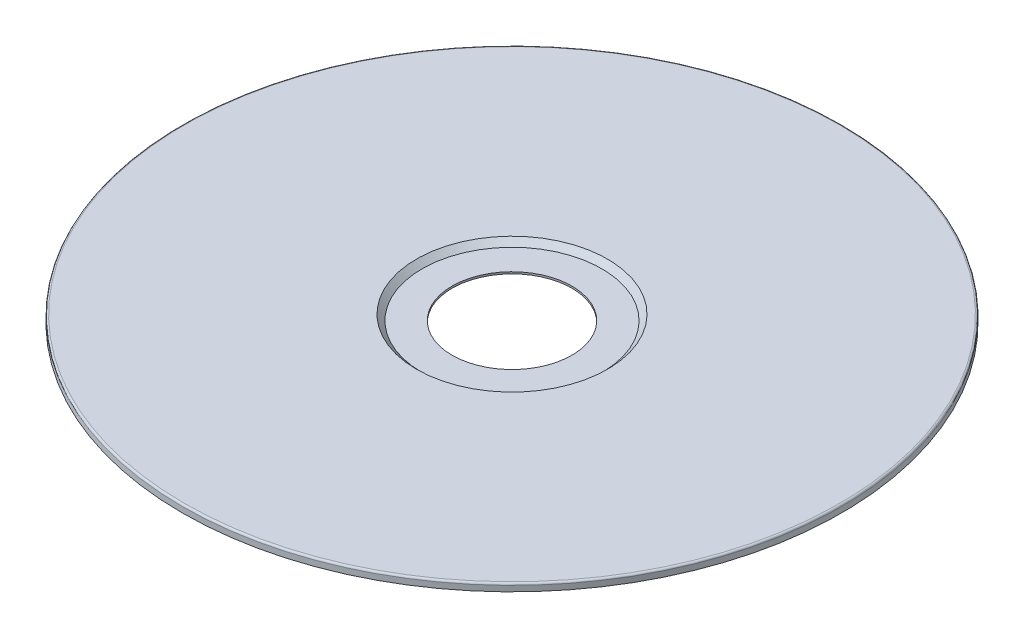
ISO-10303-21;
HEADER;
FILE_DESCRIPTION(('STEP AP214'),'2;1');
FILE_NAME('part.step','',(''),(''),'','','');
FILE_SCHEMA(('AUTOMOTIVE_DESIGN { 1 0 10303 214 1 1 1 1 }'));
ENDSEC;
DATA;
#1=APPLICATION_CONTEXT('core data for automotive mechanical design processes');
#2=APPLICATION_PROTOCOL_DEFINITION('international standard','automotive_design',2000,#1);
#3=PRODUCT_CONTEXT('',#1,'mechanical');
#4=PRODUCT('Part','Part','',(#3));
#5=PRODUCT_RELATED_PRODUCT_CATEGORY('part','',(#4));
#6=PRODUCT_DEFINITION_FORMATION('','',#4);
#7=PRODUCT_DEFINITION_CONTEXT('part definition',#1,'design');
#8=PRODUCT_DEFINITION('design','',#6,#7);
#9=PRODUCT_DEFINITION_SHAPE('','',#8);
#10=(LENGTH_UNIT() NAMED_UNIT(*) SI_UNIT(.MILLI.,.METRE.));
#11=(NAMED_UNIT(*) PLANE_ANGLE_UNIT() SI_UNIT($,.RADIAN.));
#12=(NAMED_UNIT(*) SI_UNIT($,.STERADIAN.) SOLID_ANGLE_UNIT());
#13=UNCERTAINTY_MEASURE_WITH_UNIT(LENGTH_MEASURE(1.E-05),#10,'distance_accuracy_value','');
#14=(GEOMETRIC_REPRESENTATION_CONTEXT(3) GLOBAL_UNCERTAINTY_ASSIGNED_CONTEXT((#13)) GLOBAL_UNIT_ASSIGNED_CONTEXT((#10,
#11,#12)) REPRESENTATION_CONTEXT('',''));
#15=CARTESIAN_POINT('',(0.,0.,0.));
#16=DIRECTION('',(0.,0.,1.));
#17=DIRECTION('',(1.,0.,0.));
#18=AXIS2_PLACEMENT_3D('',#15,#16,#17);
#19=CARTESIAN_POINT('',(0.,25.4,0.));
#20=DIRECTION('',(0.,-1.,0.));
#21=DIRECTION('',(0.,0.,-1.));
#22=AXIS2_PLACEMENT_3D('',#19,#20,#21);
#23=CYLINDRICAL_SURFACE('',#22,203.2);
#24=CARTESIAN_POINT('',(0.,0.,0.));
#25=DIRECTION('',(0.,1.,0.));
#26=DIRECTION('',(0.,0.,1.));
#27=AXIS2_PLACEMENT_3D('',#24,#25,#26);
#28=CIRCLE('',#27,203.2);
#29=CARTESIAN_POINT('',(0.,0.,203.2));
#30=VERTEX_POINT('',#29);
#31=EDGE_CURVE('E64',#30,#30,#28,.T.);
#32=ORIENTED_EDGE('',*,*,#31,.F.);
#33=EDGE_LOOP('',(#32));
#34=FACE_BOUND('',#33,.T.);
#35=CARTESIAN_POINT('',(0.,6.35,0.));
#36=DIRECTION('',(0.,1.,0.));
#37=DIRECTION('',(0.,0.,1.));
#38=AXIS2_PLACEMENT_3D('',#35,#36,#37);
#39=CIRCLE('',#38,203.2);
#40=CARTESIAN_POINT('',(0.,6.35,203.2));
#41=VERTEX_POINT('',#40);
#42=EDGE_CURVE('E60',#41,#41,#39,.T.);
#43=ORIENTED_EDGE('',*,*,#42,.T.);
#44=EDGE_LOOP('',(#43));
#45=FACE_BOUND('',#44,.T.);
#46=ADVANCED_FACE('F39',(#34,#45),#23,.F.);
#47=CARTESIAN_POINT('',(0.,25.4,0.));
#48=DIRECTION('',(0.,1.,0.));
#49=DIRECTION('',(0.,0.,1.));
#50=AXIS2_PLACEMENT_3D('',#47,#48,#49);
#51=PLANE('',#50);
#52=CARTESIAN_POINT('',(0.,25.4,0.));
#53=DIRECTION('',(0.,1.,0.));
#54=DIRECTION('',(0.,0.,1.));
#55=AXIS2_PLACEMENT_3D('',#52,#53,#54);
#56=CIRCLE('',#55,1111.25);
#57=CARTESIAN_POINT('',(0.,25.4,1111.25));
#58=VERTEX_POINT('',#57);
#59=EDGE_CURVE('E47',#58,#58,#56,.T.);
#60=ORIENTED_EDGE('',*,*,#59,.T.);
#61=EDGE_LOOP('',(#60));
#62=FACE_BOUND('',#61,.T.);
#63=CARTESIAN_POINT('',(0.,25.4,0.));
#64=DIRECTION('',(0.,1.,0.));
#65=DIRECTION('',(0.,0.,1.));
#66=AXIS2_PLACEMENT_3D('',#63,#64,#65);
#67=CIRCLE('',#66,323.850000000001);
#68=CARTESIAN_POINT('',(0.,25.4,323.850000000001));
#69=VERTEX_POINT('',#68);
#70=EDGE_CURVE('E52',#69,#69,#67,.F.);
#71=ORIENTED_EDGE('',*,*,#70,.T.);
#72=EDGE_LOOP('',(#71));
#73=FACE_BOUND('',#72,.T.);
#74=ADVANCED_FACE('F93',(#62,#73),#51,.T.);
#75=CARTESIAN_POINT('',(0.,0.,0.));
#76=DIRECTION('',(0.,1.,0.));
#77=DIRECTION('',(0.,0.,1.));
#78=AXIS2_PLACEMENT_3D('',#75,#76,#77);
#79=PLANE('',#78);
#80=CARTESIAN_POINT('',(0.,0.,0.));
#81=DIRECTION('',(0.,1.,0.));
#82=DIRECTION('',(0.,0.,1.));
#83=AXIS2_PLACEMENT_3D('',#80,#81,#82);
#84=CIRCLE('',#83,1117.6);
#85=CARTESIAN_POINT('',(0.,0.,1117.6));
#86=VERTEX_POINT('',#85);
#87=EDGE_CURVE('E57',#86,#86,#84,.T.);
#88=ORIENTED_EDGE('',*,*,#87,.F.);
#89=EDGE_LOOP('',(#88));
#90=FACE_BOUND('',#89,.T.);
#91=ORIENTED_EDGE('',*,*,#31,.T.);
#92=EDGE_LOOP('',(#91));
#93=FACE_BOUND('',#92,.T.);
#94=ADVANCED_FACE('F99',(#90,#93),#79,.F.);
#95=CARTESIAN_POINT('',(0.,25.4,0.));
#96=DIRECTION('',(0.,-1.,0.));
#97=DIRECTION('',(0.,0.,-1.));
#98=AXIS2_PLACEMENT_3D('',#95,#96,#97);
#99=CYLINDRICAL_SURFACE('',#98,1117.6);
#100=CARTESIAN_POINT('',(0.,19.05,0.));
#101=DIRECTION('',(0.,1.,0.));
#102=DIRECTION('',(0.,0.,1.));
#103=AXIS2_PLACEMENT_3D('',#100,#101,#102);
#104=CIRCLE('',#103,1117.6);
#105=CARTESIAN_POINT('',(0.,19.05,1117.6));
#106=VERTEX_POINT('',#105);
#107=EDGE_CURVE('E10',#106,#106,#104,.F.);
#108=ORIENTED_EDGE('',*,*,#107,.T.);
#109=EDGE_LOOP('',(#108));
#110=FACE_BOUND('',#109,.T.);
#111=ORIENTED_EDGE('',*,*,#87,.T.);
#112=EDGE_LOOP('',(#111));
#113=FACE_BOUND('',#112,.T.);
#114=ADVANCED_FACE('F86',(#110,#113),#99,.T.);
#115=CARTESIAN_POINT('',(0.,6.35,0.));
#116=DIRECTION('',(0.,1.,0.));
#117=DIRECTION('',(0.,0.,1.));
#118=AXIS2_PLACEMENT_3D('',#115,#116,#117);
#119=PLANE('',#118);
#120=ORIENTED_EDGE('',*,*,#42,.F.);
#121=EDGE_LOOP('',(#120));
#122=FACE_BOUND('',#121,.T.);
#123=CARTESIAN_POINT('',(0.,6.35,0.));
#124=DIRECTION('',(0.,1.,0.));
#125=DIRECTION('',(0.,0.,1.));
#126=AXIS2_PLACEMENT_3D('',#123,#124,#125);
#127=CIRCLE('',#126,304.8);
#128=CARTESIAN_POINT('',(0.,6.35,304.8));
#129=VERTEX_POINT('',#128);
#130=EDGE_CURVE('E65',#129,#129,#127,.T.);
#131=ORIENTED_EDGE('',*,*,#130,.T.);
#132=EDGE_LOOP('',(#131));
#133=FACE_BOUND('',#132,.T.);
#134=ADVANCED_FACE('F76',(#122,#133),#119,.T.);
#135=CARTESIAN_POINT('',(0.,6.34999999999877,0.));
#136=DIRECTION('',(0.,1.,0.));
#137=DIRECTION('',(0.,0.,1.));
#138=AXIS2_PLACEMENT_3D('',#135,#136,#137);
#139=CONICAL_SURFACE('',#138,304.8,0.785398163397454);
#140=ORIENTED_EDGE('',*,*,#70,.F.);
#141=EDGE_LOOP('',(#140));
#142=FACE_BOUND('',#141,.T.);
#143=ORIENTED_EDGE('',*,*,#130,.F.);
#144=EDGE_LOOP('',(#143));
#145=FACE_BOUND('',#144,.T.);
#146=ADVANCED_FACE('F78',(#142,#145),#139,.F.);
#147=CARTESIAN_POINT('',(0.,19.05,0.));
#148=DIRECTION('',(0.,1.,0.));
#149=DIRECTION('',(0.,0.,1.));
#150=AXIS2_PLACEMENT_3D('',#147,#148,#149);
#151=TOROIDAL_SURFACE('',#150,1111.25,6.35);
#152=ORIENTED_EDGE('',*,*,#107,.F.);
#153=EDGE_LOOP('',(#152));
#154=FACE_BOUND('',#153,.T.);
#155=ORIENTED_EDGE('',*,*,#59,.F.);
#156=EDGE_LOOP('',(#155));
#157=FACE_BOUND('',#156,.T.);
#158=ADVANCED_FACE('F41',(#154,#157),#151,.T.);
#159=CLOSED_SHELL('',(#46,#74,#94,#114,#134,#146,#158));
#160=MANIFOLD_SOLID_BREP('B2',#159);
#161=ADVANCED_BREP_SHAPE_REPRESENTATION('',(#18,#160),#14);
#162=SHAPE_DEFINITION_REPRESENTATION(#9,#161);
ENDSEC;
END-ISO-10303-21;
